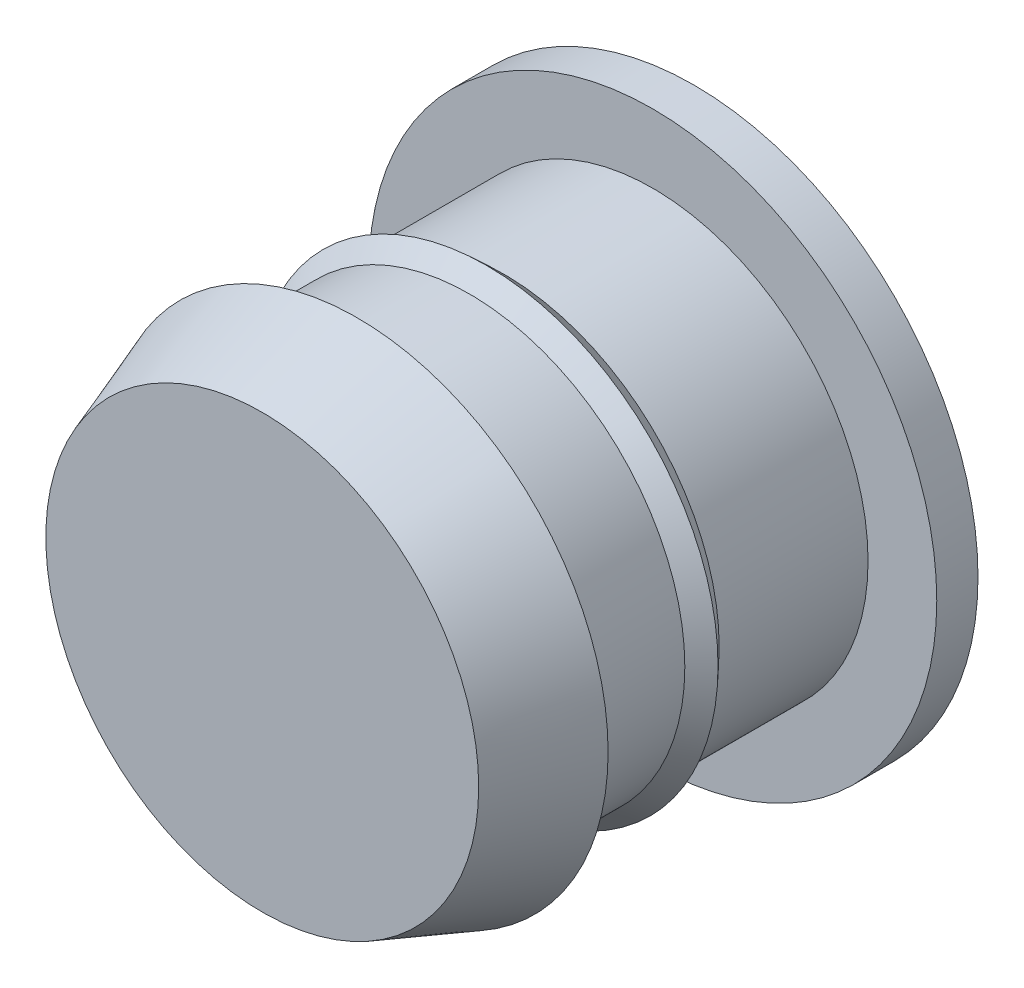
ISO-10303-21;
HEADER;
FILE_DESCRIPTION(('STEP AP214'),'2;1');
FILE_NAME('part.step','',(''),(''),'','','');
FILE_SCHEMA(('AUTOMOTIVE_DESIGN { 1 0 10303 214 1 1 1 1 }'));
ENDSEC;
DATA;
#1=APPLICATION_CONTEXT('core data for automotive mechanical design processes');
#2=APPLICATION_PROTOCOL_DEFINITION('international standard','automotive_design',2000,#1);
#3=PRODUCT_CONTEXT('',#1,'mechanical');
#4=PRODUCT('Part','Part','',(#3));
#5=PRODUCT_RELATED_PRODUCT_CATEGORY('part','',(#4));
#6=PRODUCT_DEFINITION_FORMATION('','',#4);
#7=PRODUCT_DEFINITION_CONTEXT('part definition',#1,'design');
#8=PRODUCT_DEFINITION('design','',#6,#7);
#9=PRODUCT_DEFINITION_SHAPE('','',#8);
#10=(LENGTH_UNIT() NAMED_UNIT(*) SI_UNIT(.MILLI.,.METRE.));
#11=(NAMED_UNIT(*) PLANE_ANGLE_UNIT() SI_UNIT($,.RADIAN.));
#12=(NAMED_UNIT(*) SI_UNIT($,.STERADIAN.) SOLID_ANGLE_UNIT());
#13=UNCERTAINTY_MEASURE_WITH_UNIT(LENGTH_MEASURE(1.E-05),#10,'distance_accuracy_value','');
#14=(GEOMETRIC_REPRESENTATION_CONTEXT(3) GLOBAL_UNCERTAINTY_ASSIGNED_CONTEXT((#13)) GLOBAL_UNIT_ASSIGNED_CONTEXT((#10,
#11,#12)) REPRESENTATION_CONTEXT('',''));
#15=CARTESIAN_POINT('',(0.,0.,0.));
#16=DIRECTION('',(0.,0.,1.));
#17=DIRECTION('',(1.,0.,0.));
#18=AXIS2_PLACEMENT_3D('',#15,#16,#17);
#19=CARTESIAN_POINT('',(-20.,20.,10.));
#20=DIRECTION('',(0.,0.,-1.));
#21=DIRECTION('',(-1.,0.,0.));
#22=AXIS2_PLACEMENT_3D('',#19,#20,#21);
#23=PLANE('',#22);
#24=CARTESIAN_POINT('',(-15.,20.,10.));
#25=DIRECTION('',(0.,0.,1.));
#26=DIRECTION('',(1.,0.,0.));
#27=AXIS2_PLACEMENT_3D('',#24,#25,#26);
#28=CIRCLE('',#27,12.4);
#29=CARTESIAN_POINT('',(-2.60000000000001,20.,10.));
#30=VERTEX_POINT('',#29);
#31=EDGE_CURVE('E36',#30,#30,#28,.T.);
#32=ORIENTED_EDGE('',*,*,#31,.F.);
#33=EDGE_LOOP('',(#32));
#34=FACE_BOUND('',#33,.T.);
#35=ADVANCED_FACE('F33',(#34),#23,.T.);
#36=CARTESIAN_POINT('',(0.,20.,28.85));
#37=DIRECTION('',(0.,0.,1.));
#38=DIRECTION('',(1.,0.,0.));
#39=AXIS2_PLACEMENT_3D('',#36,#37,#38);
#40=PLANE('',#39);
#41=CARTESIAN_POINT('',(-15.,20.,28.85));
#42=DIRECTION('',(0.,0.,1.));
#43=DIRECTION('',(1.,0.,0.));
#44=AXIS2_PLACEMENT_3D('',#41,#42,#43);
#45=CIRCLE('',#44,9.45);
#46=CARTESIAN_POINT('',(-5.55000000000001,20.,28.85));
#47=VERTEX_POINT('',#46);
#48=EDGE_CURVE('E49',#47,#47,#45,.T.);
#49=ORIENTED_EDGE('',*,*,#48,.T.);
#50=EDGE_LOOP('',(#49));
#51=FACE_BOUND('',#50,.T.);
#52=ADVANCED_FACE('F85',(#51),#40,.T.);
#53=CARTESIAN_POINT('',(-15.,20.,24.7));
#54=DIRECTION('',(0.,0.,-1.));
#55=DIRECTION('',(-1.,0.,0.));
#56=AXIS2_PLACEMENT_3D('',#53,#54,#55);
#57=CONICAL_SURFACE('',#56,10.95,0.346834897581007);
#58=ORIENTED_EDGE('',*,*,#48,.F.);
#59=EDGE_LOOP('',(#58));
#60=FACE_BOUND('',#59,.T.);
#61=CARTESIAN_POINT('',(-15.,20.,24.7));
#62=DIRECTION('',(0.,0.,1.));
#63=DIRECTION('',(1.,0.,0.));
#64=AXIS2_PLACEMENT_3D('',#61,#62,#63);
#65=CIRCLE('',#64,10.95);
#66=CARTESIAN_POINT('',(-4.05000000000001,20.,24.7));
#67=VERTEX_POINT('',#66);
#68=EDGE_CURVE('E44',#67,#67,#65,.T.);
#69=ORIENTED_EDGE('',*,*,#68,.T.);
#70=EDGE_LOOP('',(#69));
#71=FACE_BOUND('',#70,.T.);
#72=ADVANCED_FACE('F87',(#60,#71),#57,.T.);
#73=CARTESIAN_POINT('',(0.,20.,24.7));
#74=DIRECTION('',(0.,0.,1.));
#75=DIRECTION('',(1.,0.,0.));
#76=AXIS2_PLACEMENT_3D('',#73,#74,#75);
#77=PLANE('',#76);
#78=ORIENTED_EDGE('',*,*,#68,.F.);
#79=EDGE_LOOP('',(#78));
#80=FACE_BOUND('',#79,.T.);
#81=CARTESIAN_POINT('',(-15.,20.,24.7));
#82=DIRECTION('',(0.,0.,1.));
#83=DIRECTION('',(1.,0.,0.));
#84=AXIS2_PLACEMENT_3D('',#81,#82,#83);
#85=CIRCLE('',#84,9.4);
#86=CARTESIAN_POINT('',(-5.60000000000001,20.,24.7));
#87=VERTEX_POINT('',#86);
#88=EDGE_CURVE('E40',#87,#87,#85,.T.);
#89=ORIENTED_EDGE('',*,*,#88,.T.);
#90=EDGE_LOOP('',(#89));
#91=FACE_BOUND('',#90,.T.);
#92=ADVANCED_FACE('F94',(#80,#91),#77,.F.);
#93=CARTESIAN_POINT('',(-15.,20.,18.3));
#94=DIRECTION('',(0.,0.,1.));
#95=DIRECTION('',(1.,0.,0.));
#96=AXIS2_PLACEMENT_3D('',#93,#94,#95);
#97=CYLINDRICAL_SURFACE('',#96,9.4);
#98=ORIENTED_EDGE('',*,*,#88,.F.);
#99=EDGE_LOOP('',(#98));
#100=FACE_BOUND('',#99,.T.);
#101=CARTESIAN_POINT('',(-15.,20.,19.8));
#102=DIRECTION('',(0.,0.,1.));
#103=DIRECTION('',(1.,0.,0.));
#104=AXIS2_PLACEMENT_3D('',#101,#102,#103);
#105=CIRCLE('',#104,9.4);
#106=CARTESIAN_POINT('',(-5.60000000000001,20.,19.8));
#107=VERTEX_POINT('',#106);
#108=EDGE_CURVE('E10',#107,#107,#105,.T.);
#109=ORIENTED_EDGE('',*,*,#108,.T.);
#110=EDGE_LOOP('',(#109));
#111=FACE_BOUND('',#110,.T.);
#112=ADVANCED_FACE('F101',(#100,#111),#97,.T.);
#113=CARTESIAN_POINT('',(-15.,20.,19.8));
#114=DIRECTION('',(0.,0.,-1.));
#115=DIRECTION('',(-1.,0.,0.));
#116=AXIS2_PLACEMENT_3D('',#113,#114,#115);
#117=CONICAL_SURFACE('',#116,9.4,0.75092906239794);
#118=CARTESIAN_POINT('',(-15.,20.,19.05));
#119=DIRECTION('',(0.,0.,1.));
#120=DIRECTION('',(1.,0.,0.));
#121=AXIS2_PLACEMENT_3D('',#118,#119,#120);
#122=CIRCLE('',#121,10.1);
#123=CARTESIAN_POINT('',(-4.90000000000001,20.,19.05));
#124=VERTEX_POINT('',#123);
#125=EDGE_CURVE('E61',#124,#124,#122,.T.);
#126=ORIENTED_EDGE('',*,*,#125,.T.);
#127=EDGE_LOOP('',(#126));
#128=FACE_BOUND('',#127,.T.);
#129=ORIENTED_EDGE('',*,*,#108,.F.);
#130=EDGE_LOOP('',(#129));
#131=FACE_BOUND('',#130,.T.);
#132=ADVANCED_FACE('F65',(#128,#131),#117,.T.);
#133=CARTESIAN_POINT('',(-15.,20.,18.3));
#134=DIRECTION('',(0.,0.,1.));
#135=DIRECTION('',(1.,0.,0.));
#136=AXIS2_PLACEMENT_3D('',#133,#134,#135);
#137=CONICAL_SURFACE('',#136,9.4,0.75092906239794);
#138=ORIENTED_EDGE('',*,*,#125,.F.);
#139=EDGE_LOOP('',(#138));
#140=FACE_BOUND('',#139,.T.);
#141=CARTESIAN_POINT('',(-15.,20.,18.3));
#142=DIRECTION('',(0.,0.,1.));
#143=DIRECTION('',(1.,0.,0.));
#144=AXIS2_PLACEMENT_3D('',#141,#142,#143);
#145=CIRCLE('',#144,9.4);
#146=CARTESIAN_POINT('',(-5.60000000000001,20.,18.3));
#147=VERTEX_POINT('',#146);
#148=EDGE_CURVE('E58',#147,#147,#145,.T.);
#149=ORIENTED_EDGE('',*,*,#148,.T.);
#150=EDGE_LOOP('',(#149));
#151=FACE_BOUND('',#150,.T.);
#152=ADVANCED_FACE('F68',(#140,#151),#137,.T.);
#153=CARTESIAN_POINT('',(-15.,20.,18.3));
#154=DIRECTION('',(0.,0.,1.));
#155=DIRECTION('',(1.,0.,0.));
#156=AXIS2_PLACEMENT_3D('',#153,#154,#155);
#157=CYLINDRICAL_SURFACE('',#156,9.4);
#158=CARTESIAN_POINT('',(-15.,20.,11.8));
#159=DIRECTION('',(0.,0.,1.));
#160=DIRECTION('',(1.,0.,0.));
#161=AXIS2_PLACEMENT_3D('',#158,#159,#160);
#162=CIRCLE('',#161,9.4);
#163=CARTESIAN_POINT('',(-5.60000000000001,20.,11.8));
#164=VERTEX_POINT('',#163);
#165=EDGE_CURVE('E55',#164,#164,#162,.T.);
#166=ORIENTED_EDGE('',*,*,#165,.T.);
#167=EDGE_LOOP('',(#166));
#168=FACE_BOUND('',#167,.T.);
#169=ORIENTED_EDGE('',*,*,#148,.F.);
#170=EDGE_LOOP('',(#169));
#171=FACE_BOUND('',#170,.T.);
#172=ADVANCED_FACE('F71',(#168,#171),#157,.T.);
#173=CARTESIAN_POINT('',(0.,20.,11.8));
#174=DIRECTION('',(0.,0.,1.));
#175=DIRECTION('',(1.,0.,0.));
#176=AXIS2_PLACEMENT_3D('',#173,#174,#175);
#177=PLANE('',#176);
#178=CARTESIAN_POINT('',(-15.,20.,11.8));
#179=DIRECTION('',(0.,0.,1.));
#180=DIRECTION('',(1.,0.,0.));
#181=AXIS2_PLACEMENT_3D('',#178,#179,#180);
#182=CIRCLE('',#181,12.4);
#183=CARTESIAN_POINT('',(-2.60000000000001,20.,11.8));
#184=VERTEX_POINT('',#183);
#185=EDGE_CURVE('E52',#184,#184,#182,.T.);
#186=ORIENTED_EDGE('',*,*,#185,.T.);
#187=EDGE_LOOP('',(#186));
#188=FACE_BOUND('',#187,.T.);
#189=ORIENTED_EDGE('',*,*,#165,.F.);
#190=EDGE_LOOP('',(#189));
#191=FACE_BOUND('',#190,.T.);
#192=ADVANCED_FACE('F76',(#188,#191),#177,.T.);
#193=CARTESIAN_POINT('',(-15.,20.,18.3));
#194=DIRECTION('',(0.,0.,1.));
#195=DIRECTION('',(1.,0.,0.));
#196=AXIS2_PLACEMENT_3D('',#193,#194,#195);
#197=CYLINDRICAL_SURFACE('',#196,12.4);
#198=ORIENTED_EDGE('',*,*,#185,.F.);
#199=EDGE_LOOP('',(#198));
#200=FACE_BOUND('',#199,.T.);
#201=ORIENTED_EDGE('',*,*,#31,.T.);
#202=EDGE_LOOP('',(#201));
#203=FACE_BOUND('',#202,.T.);
#204=ADVANCED_FACE('F82',(#200,#203),#197,.T.);
#205=CLOSED_SHELL('',(#35,#52,#72,#92,#112,#132,#152,#172,#192,#204));
#206=MANIFOLD_SOLID_BREP('B2',#205);
#207=ADVANCED_BREP_SHAPE_REPRESENTATION('',(#18,#206),#14);
#208=SHAPE_DEFINITION_REPRESENTATION(#9,#207);
ENDSEC;
END-ISO-10303-21;
